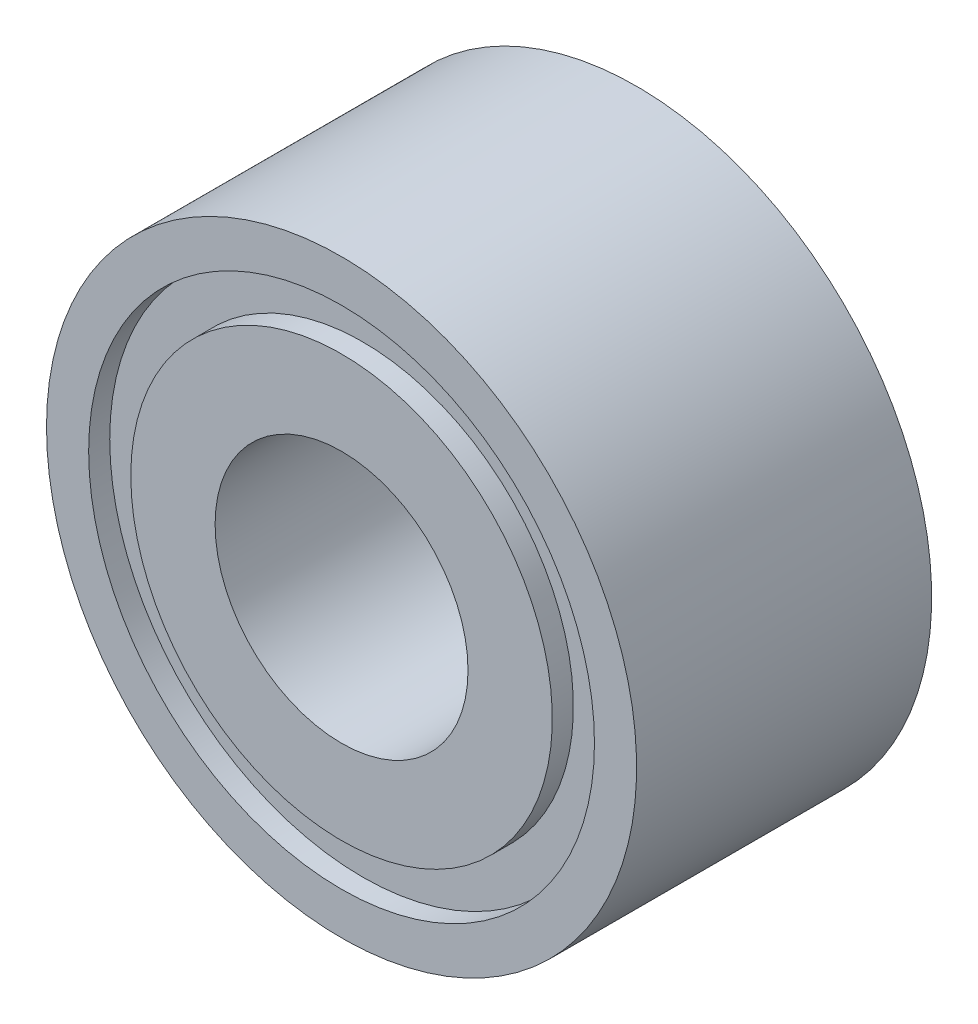
ISO-10303-21;
HEADER;
FILE_DESCRIPTION(('STEP AP214'),'2;1');
FILE_NAME('part.step','',(''),(''),'','','');
FILE_SCHEMA(('AUTOMOTIVE_DESIGN { 1 0 10303 214 1 1 1 1 }'));
ENDSEC;
DATA;
#1=APPLICATION_CONTEXT('core data for automotive mechanical design processes');
#2=APPLICATION_PROTOCOL_DEFINITION('international standard','automotive_design',2000,#1);
#3=PRODUCT_CONTEXT('',#1,'mechanical');
#4=PRODUCT('Part','Part','',(#3));
#5=PRODUCT_RELATED_PRODUCT_CATEGORY('part','',(#4));
#6=PRODUCT_DEFINITION_FORMATION('','',#4);
#7=PRODUCT_DEFINITION_CONTEXT('part definition',#1,'design');
#8=PRODUCT_DEFINITION('design','',#6,#7);
#9=PRODUCT_DEFINITION_SHAPE('','',#8);
#10=(LENGTH_UNIT() NAMED_UNIT(*) SI_UNIT(.MILLI.,.METRE.));
#11=(NAMED_UNIT(*) PLANE_ANGLE_UNIT() SI_UNIT($,.RADIAN.));
#12=(NAMED_UNIT(*) SI_UNIT($,.STERADIAN.) SOLID_ANGLE_UNIT());
#13=UNCERTAINTY_MEASURE_WITH_UNIT(LENGTH_MEASURE(1.E-05),#10,'distance_accuracy_value','');
#14=(GEOMETRIC_REPRESENTATION_CONTEXT(3) GLOBAL_UNCERTAINTY_ASSIGNED_CONTEXT((#13)) GLOBAL_UNIT_ASSIGNED_CONTEXT((#10,
#11,#12)) REPRESENTATION_CONTEXT('',''));
#15=CARTESIAN_POINT('',(0.,0.,0.));
#16=DIRECTION('',(0.,0.,1.));
#17=DIRECTION('',(1.,0.,0.));
#18=AXIS2_PLACEMENT_3D('',#15,#16,#17);
#19=CARTESIAN_POINT('',(-5.,0.,-3.5));
#20=DIRECTION('',(0.,0.,1.));
#21=DIRECTION('',(1.,0.,0.));
#22=AXIS2_PLACEMENT_3D('',#19,#20,#21);
#23=PLANE('',#22);
#24=CARTESIAN_POINT('',(0.,0.,-3.5));
#25=DIRECTION('',(0.,0.,-1.));
#26=DIRECTION('',(-1.,0.,0.));
#27=AXIS2_PLACEMENT_3D('',#24,#25,#26);
#28=CIRCLE('',#27,3.);
#29=CARTESIAN_POINT('',(-3.,0.,-3.5));
#30=VERTEX_POINT('',#29);
#31=EDGE_CURVE('E10',#30,#30,#28,.T.);
#32=ORIENTED_EDGE('',*,*,#31,.F.);
#33=EDGE_LOOP('',(#32));
#34=FACE_BOUND('',#33,.T.);
#35=CARTESIAN_POINT('',(0.,0.,-3.5));
#36=DIRECTION('',(0.,0.,-1.));
#37=DIRECTION('',(-1.,0.,0.));
#38=AXIS2_PLACEMENT_3D('',#35,#36,#37);
#39=CIRCLE('',#38,5.);
#40=CARTESIAN_POINT('',(-5.,0.,-3.5));
#41=VERTEX_POINT('',#40);
#42=EDGE_CURVE('E73',#41,#41,#39,.T.);
#43=ORIENTED_EDGE('',*,*,#42,.T.);
#44=EDGE_LOOP('',(#43));
#45=FACE_BOUND('',#44,.T.);
#46=ADVANCED_FACE('F33',(#34,#45),#23,.F.);
#47=CARTESIAN_POINT('',(0.,0.,0.));
#48=DIRECTION('',(0.,0.,-1.));
#49=DIRECTION('',(-1.,0.,0.));
#50=AXIS2_PLACEMENT_3D('',#47,#48,#49);
#51=CYLINDRICAL_SURFACE('',#50,3.);
#52=CARTESIAN_POINT('',(0.,0.,3.5));
#53=DIRECTION('',(0.,0.,-1.));
#54=DIRECTION('',(-1.,0.,0.));
#55=AXIS2_PLACEMENT_3D('',#52,#53,#54);
#56=CIRCLE('',#55,3.);
#57=CARTESIAN_POINT('',(-3.,0.,3.5));
#58=VERTEX_POINT('',#57);
#59=EDGE_CURVE('E39',#58,#58,#56,.T.);
#60=ORIENTED_EDGE('',*,*,#59,.F.);
#61=EDGE_LOOP('',(#60));
#62=FACE_BOUND('',#61,.T.);
#63=ORIENTED_EDGE('',*,*,#31,.T.);
#64=EDGE_LOOP('',(#63));
#65=FACE_BOUND('',#64,.T.);
#66=ADVANCED_FACE('F120',(#62,#65),#51,.F.);
#67=CARTESIAN_POINT('',(-5.,0.,3.5));
#68=DIRECTION('',(0.,0.,1.));
#69=DIRECTION('',(1.,0.,0.));
#70=AXIS2_PLACEMENT_3D('',#67,#68,#69);
#71=PLANE('',#70);
#72=ORIENTED_EDGE('',*,*,#59,.T.);
#73=EDGE_LOOP('',(#72));
#74=FACE_BOUND('',#73,.T.);
#75=CARTESIAN_POINT('',(0.,0.,3.5));
#76=DIRECTION('',(0.,0.,-1.));
#77=DIRECTION('',(-1.,0.,0.));
#78=AXIS2_PLACEMENT_3D('',#75,#76,#77);
#79=CIRCLE('',#78,5.);
#80=CARTESIAN_POINT('',(-5.,0.,3.5));
#81=VERTEX_POINT('',#80);
#82=EDGE_CURVE('E43',#81,#81,#79,.T.);
#83=ORIENTED_EDGE('',*,*,#82,.F.);
#84=EDGE_LOOP('',(#83));
#85=FACE_BOUND('',#84,.T.);
#86=ADVANCED_FACE('F125',(#74,#85),#71,.T.);
#87=CARTESIAN_POINT('',(0.,0.,0.));
#88=DIRECTION('',(0.,0.,-1.));
#89=DIRECTION('',(-1.,0.,0.));
#90=AXIS2_PLACEMENT_3D('',#87,#88,#89);
#91=CYLINDRICAL_SURFACE('',#90,5.);
#92=ORIENTED_EDGE('',*,*,#82,.T.);
#93=EDGE_LOOP('',(#92));
#94=FACE_BOUND('',#93,.T.);
#95=CARTESIAN_POINT('',(0.,0.,3.));
#96=DIRECTION('',(0.,0.,-1.));
#97=DIRECTION('',(-1.,0.,0.));
#98=AXIS2_PLACEMENT_3D('',#95,#96,#97);
#99=CIRCLE('',#98,5.);
#100=CARTESIAN_POINT('',(-5.,0.,3.));
#101=VERTEX_POINT('',#100);
#102=EDGE_CURVE('E47',#101,#101,#99,.T.);
#103=ORIENTED_EDGE('',*,*,#102,.F.);
#104=EDGE_LOOP('',(#103));
#105=FACE_BOUND('',#104,.T.);
#106=ADVANCED_FACE('F130',(#94,#105),#91,.T.);
#107=CARTESIAN_POINT('',(-6.,0.,3.));
#108=DIRECTION('',(0.,0.,1.));
#109=DIRECTION('',(1.,0.,0.));
#110=AXIS2_PLACEMENT_3D('',#107,#108,#109);
#111=PLANE('',#110);
#112=ORIENTED_EDGE('',*,*,#102,.T.);
#113=EDGE_LOOP('',(#112));
#114=FACE_BOUND('',#113,.T.);
#115=CARTESIAN_POINT('',(0.,0.,3.));
#116=DIRECTION('',(0.,0.,-1.));
#117=DIRECTION('',(-1.,0.,0.));
#118=AXIS2_PLACEMENT_3D('',#115,#116,#117);
#119=CIRCLE('',#118,6.);
#120=CARTESIAN_POINT('',(-6.,0.,3.));
#121=VERTEX_POINT('',#120);
#122=EDGE_CURVE('E52',#121,#121,#119,.T.);
#123=ORIENTED_EDGE('',*,*,#122,.F.);
#124=EDGE_LOOP('',(#123));
#125=FACE_BOUND('',#124,.T.);
#126=ADVANCED_FACE('F116',(#114,#125),#111,.T.);
#127=CARTESIAN_POINT('',(0.,0.,0.));
#128=DIRECTION('',(0.,0.,-1.));
#129=DIRECTION('',(-1.,0.,0.));
#130=AXIS2_PLACEMENT_3D('',#127,#128,#129);
#131=CYLINDRICAL_SURFACE('',#130,6.);
#132=ORIENTED_EDGE('',*,*,#122,.T.);
#133=EDGE_LOOP('',(#132));
#134=FACE_BOUND('',#133,.T.);
#135=CARTESIAN_POINT('',(0.,0.,3.5));
#136=DIRECTION('',(0.,0.,-1.));
#137=DIRECTION('',(-1.,0.,0.));
#138=AXIS2_PLACEMENT_3D('',#135,#136,#137);
#139=CIRCLE('',#138,6.);
#140=CARTESIAN_POINT('',(-6.,0.,3.5));
#141=VERTEX_POINT('',#140);
#142=EDGE_CURVE('E55',#141,#141,#139,.T.);
#143=ORIENTED_EDGE('',*,*,#142,.F.);
#144=EDGE_LOOP('',(#143));
#145=FACE_BOUND('',#144,.T.);
#146=ADVANCED_FACE('F110',(#134,#145),#131,.F.);
#147=CARTESIAN_POINT('',(-7.,0.,3.5));
#148=DIRECTION('',(0.,0.,1.));
#149=DIRECTION('',(1.,0.,0.));
#150=AXIS2_PLACEMENT_3D('',#147,#148,#149);
#151=PLANE('',#150);
#152=ORIENTED_EDGE('',*,*,#142,.T.);
#153=EDGE_LOOP('',(#152));
#154=FACE_BOUND('',#153,.T.);
#155=CARTESIAN_POINT('',(0.,0.,3.5));
#156=DIRECTION('',(0.,0.,-1.));
#157=DIRECTION('',(-1.,0.,0.));
#158=AXIS2_PLACEMENT_3D('',#155,#156,#157);
#159=CIRCLE('',#158,7.);
#160=CARTESIAN_POINT('',(-7.,0.,3.5));
#161=VERTEX_POINT('',#160);
#162=EDGE_CURVE('E58',#161,#161,#159,.T.);
#163=ORIENTED_EDGE('',*,*,#162,.F.);
#164=EDGE_LOOP('',(#163));
#165=FACE_BOUND('',#164,.T.);
#166=ADVANCED_FACE('F105',(#154,#165),#151,.T.);
#167=CARTESIAN_POINT('',(0.,0.,0.));
#168=DIRECTION('',(0.,0.,-1.));
#169=DIRECTION('',(-1.,0.,0.));
#170=AXIS2_PLACEMENT_3D('',#167,#168,#169);
#171=CYLINDRICAL_SURFACE('',#170,7.);
#172=CARTESIAN_POINT('',(0.,0.,-3.5));
#173=DIRECTION('',(0.,0.,-1.));
#174=DIRECTION('',(-1.,0.,0.));
#175=AXIS2_PLACEMENT_3D('',#172,#173,#174);
#176=CIRCLE('',#175,7.);
#177=CARTESIAN_POINT('',(-7.,0.,-3.5));
#178=VERTEX_POINT('',#177);
#179=EDGE_CURVE('E61',#178,#178,#176,.T.);
#180=ORIENTED_EDGE('',*,*,#179,.F.);
#181=EDGE_LOOP('',(#180));
#182=FACE_BOUND('',#181,.T.);
#183=ORIENTED_EDGE('',*,*,#162,.T.);
#184=EDGE_LOOP('',(#183));
#185=FACE_BOUND('',#184,.T.);
#186=ADVANCED_FACE('F99',(#182,#185),#171,.T.);
#187=CARTESIAN_POINT('',(-7.,0.,-3.5));
#188=DIRECTION('',(0.,0.,1.));
#189=DIRECTION('',(1.,0.,0.));
#190=AXIS2_PLACEMENT_3D('',#187,#188,#189);
#191=PLANE('',#190);
#192=CARTESIAN_POINT('',(0.,0.,-3.5));
#193=DIRECTION('',(0.,0.,-1.));
#194=DIRECTION('',(-1.,0.,0.));
#195=AXIS2_PLACEMENT_3D('',#192,#193,#194);
#196=CIRCLE('',#195,6.);
#197=CARTESIAN_POINT('',(-6.,0.,-3.5));
#198=VERTEX_POINT('',#197);
#199=EDGE_CURVE('E64',#198,#198,#196,.T.);
#200=ORIENTED_EDGE('',*,*,#199,.F.);
#201=EDGE_LOOP('',(#200));
#202=FACE_BOUND('',#201,.T.);
#203=ORIENTED_EDGE('',*,*,#179,.T.);
#204=EDGE_LOOP('',(#203));
#205=FACE_BOUND('',#204,.T.);
#206=ADVANCED_FACE('F93',(#202,#205),#191,.F.);
#207=CARTESIAN_POINT('',(0.,0.,0.));
#208=DIRECTION('',(0.,0.,-1.));
#209=DIRECTION('',(-1.,0.,0.));
#210=AXIS2_PLACEMENT_3D('',#207,#208,#209);
#211=CYLINDRICAL_SURFACE('',#210,6.);
#212=CARTESIAN_POINT('',(0.,0.,-3.));
#213=DIRECTION('',(0.,0.,-1.));
#214=DIRECTION('',(-1.,0.,0.));
#215=AXIS2_PLACEMENT_3D('',#212,#213,#214);
#216=CIRCLE('',#215,6.);
#217=CARTESIAN_POINT('',(-6.,0.,-3.));
#218=VERTEX_POINT('',#217);
#219=EDGE_CURVE('E67',#218,#218,#216,.T.);
#220=ORIENTED_EDGE('',*,*,#219,.F.);
#221=EDGE_LOOP('',(#220));
#222=FACE_BOUND('',#221,.T.);
#223=ORIENTED_EDGE('',*,*,#199,.T.);
#224=EDGE_LOOP('',(#223));
#225=FACE_BOUND('',#224,.T.);
#226=ADVANCED_FACE('F87',(#222,#225),#211,.F.);
#227=CARTESIAN_POINT('',(-6.,0.,-3.));
#228=DIRECTION('',(0.,0.,1.));
#229=DIRECTION('',(1.,0.,0.));
#230=AXIS2_PLACEMENT_3D('',#227,#228,#229);
#231=PLANE('',#230);
#232=CARTESIAN_POINT('',(0.,0.,-3.));
#233=DIRECTION('',(0.,0.,-1.));
#234=DIRECTION('',(-1.,0.,0.));
#235=AXIS2_PLACEMENT_3D('',#232,#233,#234);
#236=CIRCLE('',#235,5.);
#237=CARTESIAN_POINT('',(-5.,0.,-3.));
#238=VERTEX_POINT('',#237);
#239=EDGE_CURVE('E70',#238,#238,#236,.T.);
#240=ORIENTED_EDGE('',*,*,#239,.F.);
#241=EDGE_LOOP('',(#240));
#242=FACE_BOUND('',#241,.T.);
#243=ORIENTED_EDGE('',*,*,#219,.T.);
#244=EDGE_LOOP('',(#243));
#245=FACE_BOUND('',#244,.T.);
#246=ADVANCED_FACE('F81',(#242,#245),#231,.F.);
#247=CARTESIAN_POINT('',(0.,0.,0.));
#248=DIRECTION('',(0.,0.,-1.));
#249=DIRECTION('',(-1.,0.,0.));
#250=AXIS2_PLACEMENT_3D('',#247,#248,#249);
#251=CYLINDRICAL_SURFACE('',#250,5.);
#252=ORIENTED_EDGE('',*,*,#42,.F.);
#253=EDGE_LOOP('',(#252));
#254=FACE_BOUND('',#253,.T.);
#255=ORIENTED_EDGE('',*,*,#239,.T.);
#256=EDGE_LOOP('',(#255));
#257=FACE_BOUND('',#256,.T.);
#258=ADVANCED_FACE('F78',(#254,#257),#251,.T.);
#259=CLOSED_SHELL('',(#46,#66,#86,#106,#126,#146,#166,#186,#206,#226,#246,#258));
#260=MANIFOLD_SOLID_BREP('B2',#259);
#261=ADVANCED_BREP_SHAPE_REPRESENTATION('',(#18,#260),#14);
#262=SHAPE_DEFINITION_REPRESENTATION(#9,#261);
ENDSEC;
END-ISO-10303-21;
